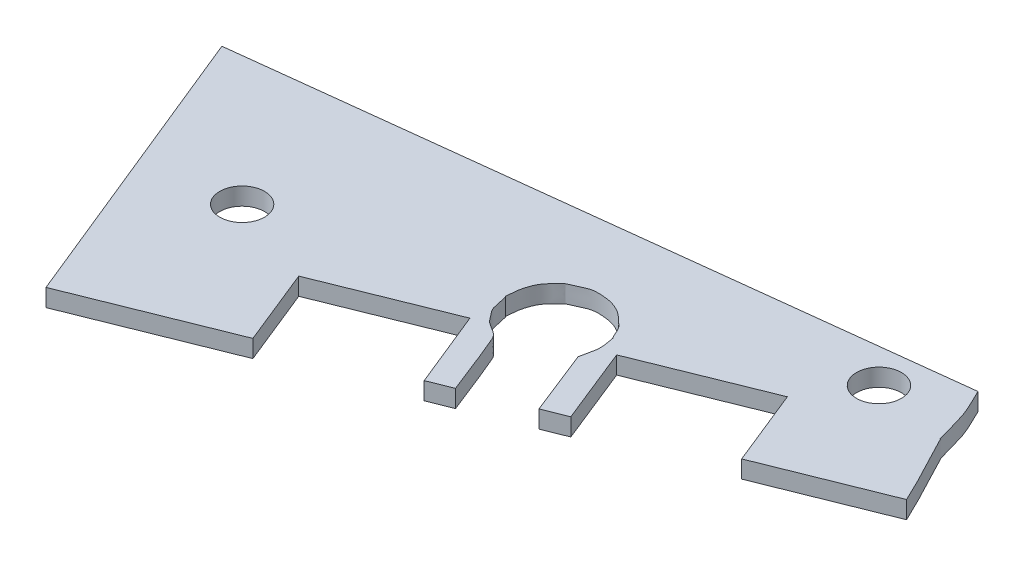
ISO-10303-21;
HEADER;
FILE_DESCRIPTION(('STEP AP214'),'2;1');
FILE_NAME('part.step','',(''),(''),'','','');
FILE_SCHEMA(('AUTOMOTIVE_DESIGN { 1 0 10303 214 1 1 1 1 }'));
ENDSEC;
DATA;
#1=APPLICATION_CONTEXT('core data for automotive mechanical design processes');
#2=APPLICATION_PROTOCOL_DEFINITION('international standard','automotive_design',2000,#1);
#3=PRODUCT_CONTEXT('',#1,'mechanical');
#4=PRODUCT('Part','Part','',(#3));
#5=PRODUCT_RELATED_PRODUCT_CATEGORY('part','',(#4));
#6=PRODUCT_DEFINITION_FORMATION('','',#4);
#7=PRODUCT_DEFINITION_CONTEXT('part definition',#1,'design');
#8=PRODUCT_DEFINITION('design','',#6,#7);
#9=PRODUCT_DEFINITION_SHAPE('','',#8);
#10=(LENGTH_UNIT() NAMED_UNIT(*) SI_UNIT(.MILLI.,.METRE.));
#11=(NAMED_UNIT(*) PLANE_ANGLE_UNIT() SI_UNIT($,.RADIAN.));
#12=(NAMED_UNIT(*) SI_UNIT($,.STERADIAN.) SOLID_ANGLE_UNIT());
#13=UNCERTAINTY_MEASURE_WITH_UNIT(LENGTH_MEASURE(1.E-05),#10,'distance_accuracy_value','');
#14=(GEOMETRIC_REPRESENTATION_CONTEXT(3) GLOBAL_UNCERTAINTY_ASSIGNED_CONTEXT((#13)) GLOBAL_UNIT_ASSIGNED_CONTEXT((#10,
#11,#12)) REPRESENTATION_CONTEXT('',''));
#15=CARTESIAN_POINT('',(0.,0.,0.));
#16=DIRECTION('',(0.,0.,1.));
#17=DIRECTION('',(1.,0.,0.));
#18=AXIS2_PLACEMENT_3D('',#15,#16,#17);
#19=CARTESIAN_POINT('',(35.9788581902602,1.19,-26.9467232131162));
#20=DIRECTION('',(0.,-1.,0.));
#21=DIRECTION('',(0.,0.,-1.));
#22=AXIS2_PLACEMENT_3D('',#19,#20,#21);
#23=PLANE('',#22);
#24=CARTESIAN_POINT('',(4.44394552127311,1.19,-18.6221592118428));
#25=DIRECTION('',(0.,1.,0.));
#26=DIRECTION('',(0.,0.,1.));
#27=AXIS2_PLACEMENT_3D('',#24,#25,#26);
#28=CIRCLE('',#27,1.27912148996529);
#29=CARTESIAN_POINT('',(4.44394552127311,1.19,-17.3430377218775));
#30=VERTEX_POINT('',#29);
#31=EDGE_CURVE('E210',#30,#30,#28,.T.);
#32=ORIENTED_EDGE('',*,*,#31,.F.);
#33=EDGE_LOOP('',(#32));
#34=FACE_BOUND('',#33,.T.);
#35=CARTESIAN_POINT('',(31.5819941178303,1.19,-27.8440418080723));
#36=DIRECTION('',(0.,1.,0.));
#37=DIRECTION('',(0.,0.,1.));
#38=AXIS2_PLACEMENT_3D('',#35,#36,#37);
#39=CIRCLE('',#38,1.28155859149822);
#40=CARTESIAN_POINT('',(31.5819941178303,1.19,-26.562483216574));
#41=VERTEX_POINT('',#40);
#42=EDGE_CURVE('E238',#41,#41,#39,.T.);
#43=ORIENTED_EDGE('',*,*,#42,.F.);
#44=EDGE_LOOP('',(#43));
#45=FACE_BOUND('',#44,.T.);
#46=DIRECTION('',(0.927982637445173,0.,-0.372623435387928));
#47=VECTOR('',#46,1.);
#48=CARTESIAN_POINT('',(37.6295653212787,1.19,-22.8357967076553));
#49=LINE('',#48,#47);
#50=CARTESIAN_POINT('',(2.95481325968816,1.19,-8.91244866960769));
#51=VERTEX_POINT('',#50);
#52=CARTESIAN_POINT('',(11.3831987343169,1.19,-12.2967942635902));
#53=VERTEX_POINT('',#52);
#54=EDGE_CURVE('E189',#51,#53,#49,.T.);
#55=ORIENTED_EDGE('',*,*,#54,.T.);
#56=DIRECTION('',(0.374266862491585,0.,0.927321042379987));
#57=VECTOR('',#56,1.);
#58=CARTESIAN_POINT('',(11.3765404474495,1.19,-12.313291501623));
#59=LINE('',#58,#57);
#60=CARTESIAN_POINT('',(9.61148219190338,1.19,-16.6865765167537));
#61=VERTEX_POINT('',#60);
#62=EDGE_CURVE('E196',#61,#53,#59,.T.);
#63=ORIENTED_EDGE('',*,*,#62,.F.);
#64=DIRECTION('',(-0.927552927526245,0.,0.373691807024842));
#65=VECTOR('',#64,1.);
#66=CARTESIAN_POINT('',(9.61148219190338,1.19,-16.6865765167537));
#67=LINE('',#66,#65);
#68=CARTESIAN_POINT('',(16.5777826434056,1.19,-19.4931542620719));
#69=VERTEX_POINT('',#68);
#70=EDGE_CURVE('E193',#69,#61,#67,.T.);
#71=ORIENTED_EDGE('',*,*,#70,.F.);
#72=DIRECTION('',(-0.376190054881045,0.,-0.926542520669503));
#73=VECTOR('',#72,1.);
#74=CARTESIAN_POINT('',(16.5777826434056,1.19,-19.4931542620719));
#75=LINE('',#74,#73);
#76=CARTESIAN_POINT('',(18.3618671807341,1.19,-15.0990184712505));
#77=VERTEX_POINT('',#76);
#78=EDGE_CURVE('E199',#77,#69,#75,.T.);
#79=ORIENTED_EDGE('',*,*,#78,.F.);
#80=CARTESIAN_POINT('',(19.6380180243655,1.19,-15.6114458510734));
#81=VERTEX_POINT('',#80);
#82=EDGE_CURVE('E313',#77,#81,#49,.T.);
#83=ORIENTED_EDGE('',*,*,#82,.T.);
#84=CARTESIAN_POINT('',(22.9999228700686,1.19,-7.20708420605326));
#85=CARTESIAN_POINT('',(22.0115475346655,1.19,-9.98661151399347));
#86=CARTESIAN_POINT('',(21.5188945967217,1.19,-10.8820647279259));
#87=CARTESIAN_POINT('',(20.0021583951109,1.19,-14.686998305048));
#88=CARTESIAN_POINT('',(19.3466827716481,1.19,-16.3313456912646));
#89=CARTESIAN_POINT('',(19.1275109478908,1.19,-16.988826809381));
#90=CARTESIAN_POINT('',(18.2342460124436,1.19,-19.0982296967628));
#91=CARTESIAN_POINT('',(18.0311634837373,1.19,-19.5777994810791));
#92=CARTESIAN_POINT('',(17.4655783405814,1.19,-19.6171123035761));
#93=CARTESIAN_POINT('',(17.1976734702197,1.19,-20.0183884446883));
#94=CARTESIAN_POINT('',(17.0440445021911,1.19,-20.2484986303312));
#95=CARTESIAN_POINT('',(16.8068058528764,1.19,-20.4410440927477));
#96=CARTESIAN_POINT('',(16.7367865661339,1.19,-20.708719001617));
#97=CARTESIAN_POINT('',(16.6637645790077,1.19,-20.9878728556309));
#98=CARTESIAN_POINT('',(16.617400623009,1.19,-21.2735503084374));
#99=CARTESIAN_POINT('',(16.5443786358828,1.19,-21.5527041624513));
#100=CARTESIAN_POINT('',(16.5398013319158,1.19,-21.5702026186516));
#101=CARTESIAN_POINT('',(16.5187823531704,1.19,-21.5782662639945));
#102=CARTESIAN_POINT('',(16.5059842118141,1.19,-21.5910473147661));
#103=B_SPLINE_CURVE_WITH_KNOTS('',3,(#84,#85,#86,#87,#88,#89,#90,#91,#92,#93,#94,#95,#96,#97,
#98,#99,#100,#101,#102),.UNSPECIFIED.,.F.,.F.,(4,3,3,3,3,3,4),(0.,1.,2.,3.,4.,5.,6.),.UNSPECIFIED.);
#104=CARTESIAN_POINT('',(16.5059842118141,1.19,-21.5910473147661));
#105=VERTEX_POINT('',#104);
#106=EDGE_CURVE('E246',#81,#105,#103,.T.);
#107=ORIENTED_EDGE('',*,*,#106,.T.);
#108=CARTESIAN_POINT('',(16.5059842118141,1.19,-21.5910473147661));
#109=CARTESIAN_POINT('',(16.5442005480148,1.19,-21.885227935876));
#110=CARTESIAN_POINT('',(16.5456222551934,1.19,-22.1865768416264));
#111=CARTESIAN_POINT('',(16.6206332204162,1.19,-22.4735891780956));
#112=CARTESIAN_POINT('',(16.6873028559704,1.19,-22.7286853205747));
#113=CARTESIAN_POINT('',(16.7797045426985,1.19,-22.9842094668508));
#114=CARTESIAN_POINT('',(16.927205728982,1.19,-23.2027553024496));
#115=CARTESIAN_POINT('',(17.1043517025042,1.19,-23.4652244783381));
#116=CARTESIAN_POINT('',(17.3614582266607,1.19,-23.6637417898316));
#117=CARTESIAN_POINT('',(17.5791172474616,1.19,-23.8937316045859));
#118=CARTESIAN_POINT('',(17.5915498323038,1.19,-23.9068685188028));
#119=CARTESIAN_POINT('',(17.6011399453458,1.19,-23.9243355141276));
#120=CARTESIAN_POINT('',(17.6174661535773,1.19,-23.9321202816761));
#121=CARTESIAN_POINT('',(17.8706540099005,1.19,-24.0528469427378));
#122=CARTESIAN_POINT('',(18.1314751599277,1.19,-24.157110454786));
#123=CARTESIAN_POINT('',(18.3846630162509,1.19,-24.2778371158476));
#124=CARTESIAN_POINT('',(18.7432825901617,1.19,-24.4488364061703));
#125=CARTESIAN_POINT('',(19.1802781374837,1.19,-24.4079919107509));
#126=CARTESIAN_POINT('',(19.5740557849677,1.19,-24.3551911491583));
#127=CARTESIAN_POINT('',(19.870796871569,1.19,-24.3154018023823));
#128=CARTESIAN_POINT('',(20.1598661302531,1.19,-24.1997934174334));
#129=CARTESIAN_POINT('',(20.4183282841305,1.19,-24.0486782970542));
#130=CARTESIAN_POINT('',(20.6925799422208,1.19,-23.888331524017));
#131=CARTESIAN_POINT('',(20.9054886390425,1.19,-23.640779489755));
#132=CARTESIAN_POINT('',(21.1476534923825,1.19,-23.4351554556649));
#133=CARTESIAN_POINT('',(21.3834549378282,1.19,-23.2349346400177));
#134=CARTESIAN_POINT('',(21.4548822220276,1.19,-22.8981514571216));
#135=CARTESIAN_POINT('',(21.6084965868502,1.19,-22.62964945785));
#136=CARTESIAN_POINT('',(21.6174785008867,1.19,-22.6139500024059));
#137=CARTESIAN_POINT('',(21.6439024964264,1.19,-22.6091401363415));
#138=CARTESIAN_POINT('',(21.6468852639403,1.19,-22.5913005517343));
#139=CARTESIAN_POINT('',(21.6958062885552,1.19,-22.2987096093937));
#140=CARTESIAN_POINT('',(21.7741519992741,1.19,-22.0052996032961));
#141=CARTESIAN_POINT('',(21.7624490049559,1.19,-21.7088780013283));
#142=CARTESIAN_POINT('',(21.7485944835091,1.19,-21.3579610197319));
#143=CARTESIAN_POINT('',(21.6349109717166,1.19,-21.0181734675178));
#144=CARTESIAN_POINT('',(21.571141955097,1.19,-20.6728212006125));
#145=B_SPLINE_CURVE_WITH_KNOTS('',3,(#108,#109,#110,#111,#112,#113,#114,#115,#116,#117,#118,
#119,#120,#121,#122,#123,#124,#125,#126,#127,#128,#129,#130,#131,#132,#133,#134,#135,#136,#137,
#138,#139,#140,#141,#142,#143,#144),.UNSPECIFIED.,.F.,.F.,(4,3,3,3,3,3,3,3,3,3,3,3,4),(0.,1.,2.,
3.,4.,5.,6.,7.,8.,9.,10.,11.,12.),.UNSPECIFIED.);
#146=CARTESIAN_POINT('',(21.571141955097,1.19,-20.6728212006125));
#147=VERTEX_POINT('',#146);
#148=EDGE_CURVE('E252',#105,#147,#145,.T.);
#149=ORIENTED_EDGE('',*,*,#148,.T.);
#150=DIRECTION('',(0.36884552030541,0.,0.929490711169634));
#151=VECTOR('',#150,1.);
#152=CARTESIAN_POINT('',(26.3793084328849,1.19,-8.55624167658697));
#153=LINE('',#152,#151);
#154=CARTESIAN_POINT('',(23.0378834854703,1.19,-16.9766325440717));
#155=VERTEX_POINT('',#154);
#156=EDGE_CURVE('E283',#147,#155,#153,.T.);
#157=ORIENTED_EDGE('',*,*,#156,.T.);
#158=CARTESIAN_POINT('',(24.3349122983001,1.19,-17.4974432926051));
#159=VERTEX_POINT('',#158);
#160=EDGE_CURVE('E185',#155,#159,#49,.T.);
#161=ORIENTED_EDGE('',*,*,#160,.T.);
#162=DIRECTION('',(0.372273642828144,0.,0.928123017091734));
#163=VECTOR('',#162,1.);
#164=CARTESIAN_POINT('',(24.3349122983001,1.19,-17.4974432926051));
#165=LINE('',#164,#163);
#166=CARTESIAN_POINT('',(22.5826617144535,1.19,-21.8660149868715));
#167=VERTEX_POINT('',#166);
#168=EDGE_CURVE('E217',#167,#159,#165,.T.);
#169=ORIENTED_EDGE('',*,*,#168,.F.);
#170=DIRECTION('',(-0.927373213546552,0.,0.374137572019093));
#171=VECTOR('',#170,1.);
#172=CARTESIAN_POINT('',(22.5826617144535,1.19,-21.8660149868715));
#173=LINE('',#172,#171);
#174=CARTESIAN_POINT('',(29.5280116278823,1.19,-24.6680328966792));
#175=VERTEX_POINT('',#174);
#176=EDGE_CURVE('E214',#175,#167,#173,.T.);
#177=ORIENTED_EDGE('',*,*,#176,.F.);
#178=DIRECTION('',(-0.374514129456685,0.,-0.927221207068357));
#179=VECTOR('',#178,1.);
#180=CARTESIAN_POINT('',(29.5280116278823,1.19,-24.6680328966792));
#181=LINE('',#180,#179);
#182=CARTESIAN_POINT('',(31.2953894742109,1.19,-20.2923629522742));
#183=VERTEX_POINT('',#182);
#184=EDGE_CURVE('E221',#183,#175,#181,.T.);
#185=ORIENTED_EDGE('',*,*,#184,.F.);
#186=CARTESIAN_POINT('',(38.0127620025457,1.19,-22.98966603456));
#187=VERTEX_POINT('',#186);
#188=EDGE_CURVE('E181',#183,#187,#49,.T.);
#189=ORIENTED_EDGE('',*,*,#188,.T.);
#190=CARTESIAN_POINT('',(41.3064860387741,1.19,-14.4944209133861));
#191=CARTESIAN_POINT('',(40.4413769049084,1.19,-16.9603625473752));
#192=CARTESIAN_POINT('',(38.8653273947854,1.19,-21.0390813626115));
#193=CARTESIAN_POINT('',(38.2178251849978,1.19,-22.5309199781212));
#194=CARTESIAN_POINT('',(37.5641807720796,1.19,-24.0369101682144));
#195=CARTESIAN_POINT('',(36.7438854848778,1.19,-25.4649666392258));
#196=CARTESIAN_POINT('',(35.9992618023672,1.19,-26.9281115543455));
#197=CARTESIAN_POINT('',(35.9910572987333,1.19,-26.9442329564106));
#198=CARTESIAN_POINT('',(35.9659381842422,1.19,-26.9489216293106));
#199=CARTESIAN_POINT('',(35.9606172707881,1.19,-26.9662103934202));
#200=CARTESIAN_POINT('',(35.7688797215146,1.19,-27.5892059164559));
#201=CARTESIAN_POINT('',(35.6349446760462,1.19,-28.230797201937));
#202=CARTESIAN_POINT('',(35.4100442098563,1.19,-28.8426031269095));
#203=CARTESIAN_POINT('',(35.2164658014839,1.19,-29.3692023785491));
#204=CARTESIAN_POINT('',(34.9423080858761,1.19,-29.8625739139352));
#205=CARTESIAN_POINT('',(34.7084400238859,1.19,-30.3725593074478));
#206=B_SPLINE_CURVE_WITH_KNOTS('',3,(#190,#191,#192,#193,#194,#195,#196,#197,#198,#199,#200,
#201,#202,#203,#204,#205),.UNSPECIFIED.,.F.,.F.,(4,3,3,3,3,4),(0.,1.,2.,3.,4.,5.),.UNSPECIFIED.);
#207=CARTESIAN_POINT('',(34.708440023886,1.19,-30.3725593074478));
#208=VERTEX_POINT('',#207);
#209=EDGE_CURVE('E178',#187,#208,#206,.T.);
#210=ORIENTED_EDGE('',*,*,#209,.T.);
#211=DIRECTION('',(-0.99324873051463,0.,0.116004134974039));
#212=VECTOR('',#211,1.);
#213=CARTESIAN_POINT('',(-3.94816815876049,1.19,-25.8577522349688));
#214=LINE('',#213,#212);
#215=CARTESIAN_POINT('',(-3.94816815876049,1.19,-25.8577522349688));
#216=VERTEX_POINT('',#215);
#217=EDGE_CURVE('E282',#208,#216,#214,.T.);
#218=ORIENTED_EDGE('',*,*,#217,.T.);
#219=DIRECTION('',(0.377265914837246,0.,0.926104977581924));
#220=VECTOR('',#219,1.);
#221=CARTESIAN_POINT('',(6.37170948359056,1.19,-0.524718751833313));
#222=LINE('',#221,#220);
#223=EDGE_CURVE('E242',#216,#51,#222,.T.);
#224=ORIENTED_EDGE('',*,*,#223,.T.);
#225=EDGE_LOOP('',(#55,#63,#71,#79,#83,#107,#149,#157,#161,#169,#177,#185,#189,#210,#218,#224));
#226=FACE_BOUND('',#225,.T.);
#227=ADVANCED_FACE('F38',(#34,#45,#226),#23,.F.);
#228=CARTESIAN_POINT('',(6.37170948359056,1.19,-0.524718751833313));
#229=DIRECTION('',(0.926104977581924,0.,-0.377265914837246));
#230=DIRECTION('',(-0.377265914837246,0.,-0.926104977581924));
#231=AXIS2_PLACEMENT_3D('',#228,#229,#230);
#232=PLANE('',#231);
#233=DIRECTION('',(0.,-1.,0.));
#234=VECTOR('',#233,1.);
#235=CARTESIAN_POINT('',(-3.94816815876049,1.19,-25.8577522349688));
#236=LINE('',#235,#234);
#237=CARTESIAN_POINT('',(-3.94816815876049,0.19,-25.8577522349688));
#238=VERTEX_POINT('',#237);
#239=EDGE_CURVE('E289',#216,#238,#236,.T.);
#240=ORIENTED_EDGE('',*,*,#239,.T.);
#241=DIRECTION('',(0.377265914837246,0.,0.926104977581924));
#242=VECTOR('',#241,1.);
#243=CARTESIAN_POINT('',(6.37170948359056,0.19,-0.524718751833313));
#244=LINE('',#243,#242);
#245=CARTESIAN_POINT('',(2.95481325968815,0.19,-8.91244866960768));
#246=VERTEX_POINT('',#245);
#247=EDGE_CURVE('E162',#238,#246,#244,.T.);
#248=ORIENTED_EDGE('',*,*,#247,.T.);
#249=DIRECTION('',(0.,1.,0.));
#250=VECTOR('',#249,1.);
#251=CARTESIAN_POINT('',(2.95481325968816,1.19,-8.91244866960769));
#252=LINE('',#251,#250);
#253=EDGE_CURVE('E187',#246,#51,#252,.T.);
#254=ORIENTED_EDGE('',*,*,#253,.T.);
#255=ORIENTED_EDGE('',*,*,#223,.F.);
#256=EDGE_LOOP('',(#240,#248,#254,#255));
#257=FACE_BOUND('',#256,.T.);
#258=ADVANCED_FACE('F40',(#257),#232,.F.);
#259=DIRECTION('',(0.,-1.,0.));
#260=VECTOR('',#259,1.);
#261=SURFACE_OF_LINEAR_EXTRUSION('',#103,#260);
#262=DIRECTION('',(0.,-1.,0.));
#263=VECTOR('',#262,1.);
#264=CARTESIAN_POINT('',(19.6380180243592,1.19,-15.6114458510708));
#265=LINE('',#264,#263);
#266=CARTESIAN_POINT('',(19.6380180243655,0.19,-15.6114458510734));
#267=VERTEX_POINT('',#266);
#268=EDGE_CURVE('E320',#81,#267,#265,.T.);
#269=ORIENTED_EDGE('',*,*,#268,.T.);
#270=CARTESIAN_POINT('',(22.9999228700686,0.19,-7.20708420605326));
#271=CARTESIAN_POINT('',(22.0115475346655,0.19,-9.98661151399347));
#272=CARTESIAN_POINT('',(21.5188945967217,0.19,-10.8820647279259));
#273=CARTESIAN_POINT('',(20.0021583951109,0.19,-14.686998305048));
#274=CARTESIAN_POINT('',(19.3466827716481,0.19,-16.3313456912646));
#275=CARTESIAN_POINT('',(19.1275109478908,0.19,-16.988826809381));
#276=CARTESIAN_POINT('',(18.2342460124436,0.19,-19.0982296967628));
#277=CARTESIAN_POINT('',(18.0311634837373,0.19,-19.5777994810791));
#278=CARTESIAN_POINT('',(17.4655783405814,0.19,-19.6171123035761));
#279=CARTESIAN_POINT('',(17.1976734702197,0.19,-20.0183884446883));
#280=CARTESIAN_POINT('',(17.0440445021911,0.19,-20.2484986303312));
#281=CARTESIAN_POINT('',(16.8068058528764,0.19,-20.4410440927477));
#282=CARTESIAN_POINT('',(16.7367865661339,0.19,-20.708719001617));
#283=CARTESIAN_POINT('',(16.6637645790077,0.19,-20.9878728556309));
#284=CARTESIAN_POINT('',(16.617400623009,0.19,-21.2735503084374));
#285=CARTESIAN_POINT('',(16.5443786358828,0.19,-21.5527041624513));
#286=CARTESIAN_POINT('',(16.5398013319158,0.19,-21.5702026186516));
#287=CARTESIAN_POINT('',(16.5187823531704,0.19,-21.5782662639945));
#288=CARTESIAN_POINT('',(16.5059842118141,0.19,-21.5910473147661));
#289=B_SPLINE_CURVE_WITH_KNOTS('',3,(#270,#271,#272,#273,#274,#275,#276,#277,#278,#279,#280,
#281,#282,#283,#284,#285,#286,#287,#288),.UNSPECIFIED.,.F.,.F.,(4,3,3,3,3,3,4),(0.,1.,2.,3.,4.,
5.,6.),.UNSPECIFIED.);
#290=CARTESIAN_POINT('',(16.5059842118141,0.19,-21.5910473147661));
#291=VERTEX_POINT('',#290);
#292=EDGE_CURVE('E321',#267,#291,#289,.T.);
#293=ORIENTED_EDGE('',*,*,#292,.T.);
#294=DIRECTION('',(0.,-1.,0.));
#295=VECTOR('',#294,1.);
#296=CARTESIAN_POINT('',(16.5059842118141,1.19,-21.5910473147661));
#297=LINE('',#296,#295);
#298=EDGE_CURVE('E300',#105,#291,#297,.T.);
#299=ORIENTED_EDGE('',*,*,#298,.F.);
#300=ORIENTED_EDGE('',*,*,#106,.F.);
#301=EDGE_LOOP('',(#269,#293,#299,#300));
#302=FACE_BOUND('',#301,.T.);
#303=ADVANCED_FACE('F260',(#302),#261,.F.);
#304=DIRECTION('',(0.,-1.,0.));
#305=VECTOR('',#304,1.);
#306=SURFACE_OF_LINEAR_EXTRUSION('',#145,#305);
#307=ORIENTED_EDGE('',*,*,#298,.T.);
#308=CARTESIAN_POINT('',(16.5059842118141,0.19,-21.5910473147661));
#309=CARTESIAN_POINT('',(16.5442005480148,0.19,-21.885227935876));
#310=CARTESIAN_POINT('',(16.5456222551934,0.19,-22.1865768416264));
#311=CARTESIAN_POINT('',(16.6206332204162,0.19,-22.4735891780956));
#312=CARTESIAN_POINT('',(16.6873028559704,0.19,-22.7286853205747));
#313=CARTESIAN_POINT('',(16.7797045426985,0.19,-22.9842094668508));
#314=CARTESIAN_POINT('',(16.927205728982,0.19,-23.2027553024496));
#315=CARTESIAN_POINT('',(17.1043517025042,0.19,-23.4652244783381));
#316=CARTESIAN_POINT('',(17.3614582266607,0.19,-23.6637417898316));
#317=CARTESIAN_POINT('',(17.5791172474616,0.19,-23.8937316045859));
#318=CARTESIAN_POINT('',(17.5915498323038,0.19,-23.9068685188028));
#319=CARTESIAN_POINT('',(17.6011399453458,0.19,-23.9243355141276));
#320=CARTESIAN_POINT('',(17.6174661535773,0.19,-23.9321202816761));
#321=CARTESIAN_POINT('',(17.8706540099005,0.19,-24.0528469427378));
#322=CARTESIAN_POINT('',(18.1314751599277,0.19,-24.157110454786));
#323=CARTESIAN_POINT('',(18.3846630162509,0.19,-24.2778371158476));
#324=CARTESIAN_POINT('',(18.7432825901617,0.19,-24.4488364061703));
#325=CARTESIAN_POINT('',(19.1802781374837,0.19,-24.4079919107509));
#326=CARTESIAN_POINT('',(19.5740557849677,0.19,-24.3551911491583));
#327=CARTESIAN_POINT('',(19.870796871569,0.19,-24.3154018023823));
#328=CARTESIAN_POINT('',(20.1598661302531,0.19,-24.1997934174334));
#329=CARTESIAN_POINT('',(20.4183282841305,0.19,-24.0486782970542));
#330=CARTESIAN_POINT('',(20.6925799422208,0.19,-23.888331524017));
#331=CARTESIAN_POINT('',(20.9054886390425,0.19,-23.640779489755));
#332=CARTESIAN_POINT('',(21.1476534923825,0.19,-23.4351554556649));
#333=CARTESIAN_POINT('',(21.3834549378282,0.19,-23.2349346400177));
#334=CARTESIAN_POINT('',(21.4548822220276,0.19,-22.8981514571216));
#335=CARTESIAN_POINT('',(21.6084965868502,0.19,-22.62964945785));
#336=CARTESIAN_POINT('',(21.6174785008867,0.19,-22.6139500024059));
#337=CARTESIAN_POINT('',(21.6439024964264,0.19,-22.6091401363415));
#338=CARTESIAN_POINT('',(21.6468852639403,0.19,-22.5913005517343));
#339=CARTESIAN_POINT('',(21.6958062885552,0.19,-22.2987096093937));
#340=CARTESIAN_POINT('',(21.7741519992741,0.19,-22.0052996032961));
#341=CARTESIAN_POINT('',(21.7624490049559,0.19,-21.7088780013283));
#342=CARTESIAN_POINT('',(21.7485944835091,0.19,-21.3579610197319));
#343=CARTESIAN_POINT('',(21.6349109717166,0.19,-21.0181734675178));
#344=CARTESIAN_POINT('',(21.571141955097,0.19,-20.6728212006125));
#345=B_SPLINE_CURVE_WITH_KNOTS('',3,(#308,#309,#310,#311,#312,#313,#314,#315,#316,#317,#318,
#319,#320,#321,#322,#323,#324,#325,#326,#327,#328,#329,#330,#331,#332,#333,#334,#335,#336,#337,
#338,#339,#340,#341,#342,#343,#344),.UNSPECIFIED.,.F.,.F.,(4,3,3,3,3,3,3,3,3,3,3,3,4),(0.,1.,2.,
3.,4.,5.,6.,7.,8.,9.,10.,11.,12.),.UNSPECIFIED.);
#346=CARTESIAN_POINT('',(21.571141955097,0.19,-20.6728212006125));
#347=VERTEX_POINT('',#346);
#348=EDGE_CURVE('E328',#291,#347,#345,.T.);
#349=ORIENTED_EDGE('',*,*,#348,.T.);
#350=DIRECTION('',(0.,-1.,0.));
#351=VECTOR('',#350,1.);
#352=CARTESIAN_POINT('',(21.571141955097,1.19,-20.6728212006125));
#353=LINE('',#352,#351);
#354=EDGE_CURVE('E296',#147,#347,#353,.T.);
#355=ORIENTED_EDGE('',*,*,#354,.F.);
#356=ORIENTED_EDGE('',*,*,#148,.F.);
#357=EDGE_LOOP('',(#307,#349,#355,#356));
#358=FACE_BOUND('',#357,.T.);
#359=ADVANCED_FACE('F263',(#358),#306,.F.);
#360=CARTESIAN_POINT('',(26.3793084328849,1.19,-8.55624167658697));
#361=DIRECTION('',(0.929490711169634,0.,-0.36884552030541));
#362=DIRECTION('',(-0.36884552030541,0.,-0.929490711169634));
#363=AXIS2_PLACEMENT_3D('',#360,#361,#362);
#364=PLANE('',#363);
#365=ORIENTED_EDGE('',*,*,#354,.T.);
#366=DIRECTION('',(0.36884552030541,0.,0.929490711169634));
#367=VECTOR('',#366,1.);
#368=CARTESIAN_POINT('',(26.3793084328849,0.19,-8.55624167658697));
#369=LINE('',#368,#367);
#370=CARTESIAN_POINT('',(23.0378834854703,0.19,-16.9766325440717));
#371=VERTEX_POINT('',#370);
#372=EDGE_CURVE('E356',#347,#371,#369,.T.);
#373=ORIENTED_EDGE('',*,*,#372,.T.);
#374=DIRECTION('',(0.,1.,0.));
#375=VECTOR('',#374,1.);
#376=CARTESIAN_POINT('',(23.0378834854703,1.19,-16.9766325440717));
#377=LINE('',#376,#375);
#378=EDGE_CURVE('E180',#371,#155,#377,.T.);
#379=ORIENTED_EDGE('',*,*,#378,.T.);
#380=ORIENTED_EDGE('',*,*,#156,.F.);
#381=EDGE_LOOP('',(#365,#373,#379,#380));
#382=FACE_BOUND('',#381,.T.);
#383=ADVANCED_FACE('F267',(#382),#364,.F.);
#384=DIRECTION('',(0.,-1.,0.));
#385=VECTOR('',#384,1.);
#386=SURFACE_OF_LINEAR_EXTRUSION('',#206,#385);
#387=DIRECTION('',(0.,-1.,0.));
#388=VECTOR('',#387,1.);
#389=CARTESIAN_POINT('',(38.0127620021032,1.19,-22.9896660343823));
#390=LINE('',#389,#388);
#391=CARTESIAN_POINT('',(38.0127620025457,0.19,-22.98966603456));
#392=VERTEX_POINT('',#391);
#393=EDGE_CURVE('E167',#187,#392,#390,.T.);
#394=ORIENTED_EDGE('',*,*,#393,.T.);
#395=CARTESIAN_POINT('',(41.3064860387741,0.19,-14.4944209133861));
#396=CARTESIAN_POINT('',(40.4413769049084,0.19,-16.9603625473752));
#397=CARTESIAN_POINT('',(38.8653273947854,0.19,-21.0390813626115));
#398=CARTESIAN_POINT('',(38.2178251849978,0.19,-22.5309199781212));
#399=CARTESIAN_POINT('',(37.5641807720796,0.19,-24.0369101682144));
#400=CARTESIAN_POINT('',(36.7438854848778,0.19,-25.4649666392258));
#401=CARTESIAN_POINT('',(35.9992618023672,0.19,-26.9281115543455));
#402=CARTESIAN_POINT('',(35.9910572987333,0.19,-26.9442329564106));
#403=CARTESIAN_POINT('',(35.9659381842422,0.19,-26.9489216293106));
#404=CARTESIAN_POINT('',(35.9606172707881,0.19,-26.9662103934202));
#405=CARTESIAN_POINT('',(35.7688797215146,0.19,-27.5892059164559));
#406=CARTESIAN_POINT('',(35.6349446760462,0.19,-28.230797201937));
#407=CARTESIAN_POINT('',(35.4100442098563,0.19,-28.8426031269095));
#408=CARTESIAN_POINT('',(35.2164658014839,0.19,-29.3692023785491));
#409=CARTESIAN_POINT('',(34.9423080858761,0.19,-29.8625739139352));
#410=CARTESIAN_POINT('',(34.7084400238859,0.19,-30.3725593074478));
#411=B_SPLINE_CURVE_WITH_KNOTS('',3,(#395,#396,#397,#398,#399,#400,#401,#402,#403,#404,#405,
#406,#407,#408,#409,#410),.UNSPECIFIED.,.F.,.F.,(4,3,3,3,3,4),(0.,1.,2.,3.,4.,5.),.UNSPECIFIED.);
#412=CARTESIAN_POINT('',(34.708440023886,0.19,-30.3725593074478));
#413=VERTEX_POINT('',#412);
#414=EDGE_CURVE('E150',#392,#413,#411,.T.);
#415=ORIENTED_EDGE('',*,*,#414,.T.);
#416=DIRECTION('',(0.,-1.,0.));
#417=VECTOR('',#416,1.);
#418=CARTESIAN_POINT('',(34.708440023886,1.19,-30.3725593074478));
#419=LINE('',#418,#417);
#420=EDGE_CURVE('E293',#208,#413,#419,.T.);
#421=ORIENTED_EDGE('',*,*,#420,.F.);
#422=ORIENTED_EDGE('',*,*,#209,.F.);
#423=EDGE_LOOP('',(#394,#415,#421,#422));
#424=FACE_BOUND('',#423,.T.);
#425=ADVANCED_FACE('F177',(#424),#386,.F.);
#426=CARTESIAN_POINT('',(-3.94816815876049,1.19,-25.8577522349688));
#427=DIRECTION('',(0.116004134974039,0.,0.99324873051463));
#428=DIRECTION('',(0.99324873051463,0.,-0.116004134974039));
#429=AXIS2_PLACEMENT_3D('',#426,#427,#428);
#430=PLANE('',#429);
#431=ORIENTED_EDGE('',*,*,#420,.T.);
#432=DIRECTION('',(-0.99324873051463,0.,0.116004134974039));
#433=VECTOR('',#432,1.);
#434=CARTESIAN_POINT('',(-3.94816815876049,0.19,-25.8577522349688));
#435=LINE('',#434,#433);
#436=EDGE_CURVE('E156',#413,#238,#435,.T.);
#437=ORIENTED_EDGE('',*,*,#436,.T.);
#438=ORIENTED_EDGE('',*,*,#239,.F.);
#439=ORIENTED_EDGE('',*,*,#217,.F.);
#440=EDGE_LOOP('',(#431,#437,#438,#439));
#441=FACE_BOUND('',#440,.T.);
#442=ADVANCED_FACE('F275',(#441),#430,.F.);
#443=CARTESIAN_POINT('',(31.5819941178303,1.19,-27.8440418080723));
#444=DIRECTION('',(0.,-1.,0.));
#445=DIRECTION('',(0.,0.,-1.));
#446=AXIS2_PLACEMENT_3D('',#443,#444,#445);
#447=CYLINDRICAL_SURFACE('',#446,1.28155859149822);
#448=CARTESIAN_POINT('',(31.5819941178303,0.19,-27.8440418080723));
#449=DIRECTION('',(0.,1.,0.));
#450=DIRECTION('',(0.,0.,1.));
#451=AXIS2_PLACEMENT_3D('',#448,#449,#450);
#452=CIRCLE('',#451,1.28155859149822);
#453=CARTESIAN_POINT('',(31.5819941178303,0.19,-26.562483216574));
#454=VERTEX_POINT('',#453);
#455=EDGE_CURVE('E342',#454,#454,#452,.T.);
#456=ORIENTED_EDGE('',*,*,#455,.F.);
#457=EDGE_LOOP('',(#456));
#458=FACE_BOUND('',#457,.T.);
#459=ORIENTED_EDGE('',*,*,#42,.T.);
#460=EDGE_LOOP('',(#459));
#461=FACE_BOUND('',#460,.T.);
#462=ADVANCED_FACE('F433',(#458,#461),#447,.F.);
#463=CARTESIAN_POINT('',(22.5826617144535,1.19,-21.8660149868715));
#464=DIRECTION('',(0.374137572019093,0.,0.927373213546552));
#465=DIRECTION('',(0.927373213546552,0.,-0.374137572019093));
#466=AXIS2_PLACEMENT_3D('',#463,#464,#465);
#467=PLANE('',#466);
#468=DIRECTION('',(-0.927373213546552,0.,0.374137572019093));
#469=VECTOR('',#468,1.);
#470=CARTESIAN_POINT('',(22.5826617144535,0.19,-21.8660149868715));
#471=LINE('',#470,#469);
#472=CARTESIAN_POINT('',(29.5280116278823,0.19,-24.6680328966792));
#473=VERTEX_POINT('',#472);
#474=CARTESIAN_POINT('',(22.5826617144535,0.19,-21.8660149868715));
#475=VERTEX_POINT('',#474);
#476=EDGE_CURVE('E400',#473,#475,#471,.T.);
#477=ORIENTED_EDGE('',*,*,#476,.F.);
#478=DIRECTION('',(0.,-1.,0.));
#479=VECTOR('',#478,1.);
#480=CARTESIAN_POINT('',(29.5280116278823,1.19,-24.6680328966792));
#481=LINE('',#480,#479);
#482=EDGE_CURVE('E224',#175,#473,#481,.T.);
#483=ORIENTED_EDGE('',*,*,#482,.F.);
#484=ORIENTED_EDGE('',*,*,#176,.T.);
#485=DIRECTION('',(0.,-1.,0.));
#486=VECTOR('',#485,1.);
#487=CARTESIAN_POINT('',(22.5826617144535,1.19,-21.8660149868715));
#488=LINE('',#487,#486);
#489=EDGE_CURVE('E234',#167,#475,#488,.T.);
#490=ORIENTED_EDGE('',*,*,#489,.T.);
#491=EDGE_LOOP('',(#477,#483,#484,#490));
#492=FACE_BOUND('',#491,.T.);
#493=ADVANCED_FACE('F409',(#492),#467,.T.);
#494=CARTESIAN_POINT('',(24.3349122983001,1.19,-17.4974432926051));
#495=DIRECTION('',(0.928123017091734,0.,-0.372273642828144));
#496=DIRECTION('',(-0.372273642828144,0.,-0.928123017091734));
#497=AXIS2_PLACEMENT_3D('',#494,#495,#496);
#498=PLANE('',#497);
#499=DIRECTION('',(0.372273642828144,0.,0.928123017091734));
#500=VECTOR('',#499,1.);
#501=CARTESIAN_POINT('',(24.3349122983001,0.19,-17.4974432926051));
#502=LINE('',#501,#500);
#503=CARTESIAN_POINT('',(24.3349122983001,0.19,-17.4974432926051));
#504=VERTEX_POINT('',#503);
#505=EDGE_CURVE('E54',#475,#504,#502,.T.);
#506=ORIENTED_EDGE('',*,*,#505,.F.);
#507=ORIENTED_EDGE('',*,*,#489,.F.);
#508=ORIENTED_EDGE('',*,*,#168,.T.);
#509=DIRECTION('',(0.,-1.,0.));
#510=VECTOR('',#509,1.);
#511=CARTESIAN_POINT('',(24.3349122983001,1.19,-17.4974432926051));
#512=LINE('',#511,#510);
#513=EDGE_CURVE('E230',#159,#504,#512,.T.);
#514=ORIENTED_EDGE('',*,*,#513,.T.);
#515=EDGE_LOOP('',(#506,#507,#508,#514));
#516=FACE_BOUND('',#515,.T.);
#517=ADVANCED_FACE('F408',(#516),#498,.T.);
#518=CARTESIAN_POINT('',(29.5280116278823,1.19,-24.6680328966792));
#519=DIRECTION('',(-0.927221207068357,0.,0.374514129456685));
#520=DIRECTION('',(0.374514129456685,0.,0.927221207068357));
#521=AXIS2_PLACEMENT_3D('',#518,#519,#520);
#522=PLANE('',#521);
#523=DIRECTION('',(-0.374514129456685,0.,-0.927221207068357));
#524=VECTOR('',#523,1.);
#525=CARTESIAN_POINT('',(29.5280116278823,0.19,-24.6680328966792));
#526=LINE('',#525,#524);
#527=CARTESIAN_POINT('',(31.2953894742109,0.19,-20.2923629522742));
#528=VERTEX_POINT('',#527);
#529=EDGE_CURVE('E397',#528,#473,#526,.T.);
#530=ORIENTED_EDGE('',*,*,#529,.F.);
#531=DIRECTION('',(0.,-1.,0.));
#532=VECTOR('',#531,1.);
#533=CARTESIAN_POINT('',(31.2953894742109,1.19,-20.2923629522742));
#534=LINE('',#533,#532);
#535=EDGE_CURVE('E170',#183,#528,#534,.T.);
#536=ORIENTED_EDGE('',*,*,#535,.F.);
#537=ORIENTED_EDGE('',*,*,#184,.T.);
#538=ORIENTED_EDGE('',*,*,#482,.T.);
#539=EDGE_LOOP('',(#530,#536,#537,#538));
#540=FACE_BOUND('',#539,.T.);
#541=ADVANCED_FACE('F413',(#540),#522,.T.);
#542=CARTESIAN_POINT('',(4.44394552127311,1.19,-18.6221592118428));
#543=DIRECTION('',(0.,-1.,0.));
#544=DIRECTION('',(0.,0.,-1.));
#545=AXIS2_PLACEMENT_3D('',#542,#543,#544);
#546=CYLINDRICAL_SURFACE('',#545,1.27912148996529);
#547=CARTESIAN_POINT('',(4.44394552127311,0.19,-18.6221592118428));
#548=DIRECTION('',(0.,1.,0.));
#549=DIRECTION('',(0.,0.,1.));
#550=AXIS2_PLACEMENT_3D('',#547,#548,#549);
#551=CIRCLE('',#550,1.27912148996529);
#552=CARTESIAN_POINT('',(4.44394552127311,0.19,-17.3430377218775));
#553=VERTEX_POINT('',#552);
#554=EDGE_CURVE('E393',#553,#553,#551,.T.);
#555=ORIENTED_EDGE('',*,*,#554,.F.);
#556=EDGE_LOOP('',(#555));
#557=FACE_BOUND('',#556,.T.);
#558=ORIENTED_EDGE('',*,*,#31,.T.);
#559=EDGE_LOOP('',(#558));
#560=FACE_BOUND('',#559,.T.);
#561=ADVANCED_FACE('F415',(#557,#560),#546,.F.);
#562=CARTESIAN_POINT('',(9.61148219190338,1.19,-16.6865765167537));
#563=DIRECTION('',(0.373691807024842,0.,0.927552927526245));
#564=DIRECTION('',(0.927552927526246,0.,-0.373691807024842));
#565=AXIS2_PLACEMENT_3D('',#562,#563,#564);
#566=PLANE('',#565);
#567=DIRECTION('',(-0.927552927526246,0.,0.373691807024842));
#568=VECTOR('',#567,1.);
#569=CARTESIAN_POINT('',(9.61148219190338,0.19,-16.6865765167537));
#570=LINE('',#569,#568);
#571=CARTESIAN_POINT('',(16.5777826434056,0.19,-19.4931542620719));
#572=VERTEX_POINT('',#571);
#573=CARTESIAN_POINT('',(9.61148219190338,0.19,-16.6865765167537));
#574=VERTEX_POINT('',#573);
#575=EDGE_CURVE('E387',#572,#574,#570,.T.);
#576=ORIENTED_EDGE('',*,*,#575,.F.);
#577=DIRECTION('',(0.,-1.,0.));
#578=VECTOR('',#577,1.);
#579=CARTESIAN_POINT('',(16.5777826434056,1.19,-19.4931542620719));
#580=LINE('',#579,#578);
#581=EDGE_CURVE('E202',#69,#572,#580,.T.);
#582=ORIENTED_EDGE('',*,*,#581,.F.);
#583=ORIENTED_EDGE('',*,*,#70,.T.);
#584=DIRECTION('',(0.,-1.,0.));
#585=VECTOR('',#584,1.);
#586=CARTESIAN_POINT('',(9.61148219190338,1.19,-16.6865765167537));
#587=LINE('',#586,#585);
#588=EDGE_CURVE('E206',#61,#574,#587,.T.);
#589=ORIENTED_EDGE('',*,*,#588,.T.);
#590=EDGE_LOOP('',(#576,#582,#583,#589));
#591=FACE_BOUND('',#590,.T.);
#592=ADVANCED_FACE('F421',(#591),#566,.T.);
#593=CARTESIAN_POINT('',(11.3765404474495,1.19,-12.313291501623));
#594=DIRECTION('',(0.927321042379987,0.,-0.374266862491585));
#595=DIRECTION('',(-0.374266862491585,0.,-0.927321042379987));
#596=AXIS2_PLACEMENT_3D('',#593,#594,#595);
#597=PLANE('',#596);
#598=DIRECTION('',(0.374266862491585,0.,0.927321042379987));
#599=VECTOR('',#598,1.);
#600=CARTESIAN_POINT('',(11.3765404474495,0.19,-12.313291501623));
#601=LINE('',#600,#599);
#602=CARTESIAN_POINT('',(11.3831987343169,0.19,-12.2967942635902));
#603=VERTEX_POINT('',#602);
#604=EDGE_CURVE('E390',#574,#603,#601,.T.);
#605=ORIENTED_EDGE('',*,*,#604,.F.);
#606=ORIENTED_EDGE('',*,*,#588,.F.);
#607=ORIENTED_EDGE('',*,*,#62,.T.);
#608=DIRECTION('',(0.,1.,0.));
#609=VECTOR('',#608,1.);
#610=CARTESIAN_POINT('',(11.3831987343169,2.54,-12.2967942635902));
#611=LINE('',#610,#609);
#612=EDGE_CURVE('E47',#603,#53,#611,.T.);
#613=ORIENTED_EDGE('',*,*,#612,.F.);
#614=EDGE_LOOP('',(#605,#606,#607,#613));
#615=FACE_BOUND('',#614,.T.);
#616=ADVANCED_FACE('F466',(#615),#597,.T.);
#617=CARTESIAN_POINT('',(16.5777826434056,1.19,-19.4931542620719));
#618=DIRECTION('',(-0.926542520669503,0.,0.376190054881045));
#619=DIRECTION('',(0.376190054881045,0.,0.926542520669503));
#620=AXIS2_PLACEMENT_3D('',#617,#618,#619);
#621=PLANE('',#620);
#622=DIRECTION('',(-0.376190054881045,0.,-0.926542520669503));
#623=VECTOR('',#622,1.);
#624=CARTESIAN_POINT('',(16.5777826434056,0.19,-19.4931542620719));
#625=LINE('',#624,#623);
#626=CARTESIAN_POINT('',(18.3618671807341,0.19,-15.0990184712505));
#627=VERTEX_POINT('',#626);
#628=EDGE_CURVE('E172',#627,#572,#625,.T.);
#629=ORIENTED_EDGE('',*,*,#628,.F.);
#630=DIRECTION('',(0.,-1.,0.));
#631=VECTOR('',#630,1.);
#632=CARTESIAN_POINT('',(18.3618671807341,1.19,-15.0990184712505));
#633=LINE('',#632,#631);
#634=EDGE_CURVE('E304',#77,#627,#633,.T.);
#635=ORIENTED_EDGE('',*,*,#634,.F.);
#636=ORIENTED_EDGE('',*,*,#78,.T.);
#637=ORIENTED_EDGE('',*,*,#581,.T.);
#638=EDGE_LOOP('',(#629,#635,#636,#637));
#639=FACE_BOUND('',#638,.T.);
#640=ADVANCED_FACE('F474',(#639),#621,.T.);
#641=CARTESIAN_POINT('',(2.12189954212739,2.54,-8.57799934017445));
#642=DIRECTION('',(-0.372623435387928,0.,-0.927982637445173));
#643=DIRECTION('',(-0.927982637445173,0.,0.372623435387928));
#644=AXIS2_PLACEMENT_3D('',#641,#642,#643);
#645=PLANE('',#644);
#646=ORIENTED_EDGE('',*,*,#634,.T.);
#647=DIRECTION('',(-0.927982637445173,0.,0.372623435387928));
#648=VECTOR('',#647,1.);
#649=CARTESIAN_POINT('',(38.0127620025457,0.19,-22.98966603456));
#650=LINE('',#649,#648);
#651=EDGE_CURVE('E173',#267,#627,#650,.T.);
#652=ORIENTED_EDGE('',*,*,#651,.F.);
#653=ORIENTED_EDGE('',*,*,#268,.F.);
#654=ORIENTED_EDGE('',*,*,#82,.F.);
#655=EDGE_LOOP('',(#646,#652,#653,#654));
#656=FACE_BOUND('',#655,.T.);
#657=ADVANCED_FACE('F380',(#656),#645,.F.);
#658=ORIENTED_EDGE('',*,*,#253,.F.);
#659=EDGE_CURVE('E175',#603,#246,#650,.T.);
#660=ORIENTED_EDGE('',*,*,#659,.F.);
#661=ORIENTED_EDGE('',*,*,#612,.T.);
#662=ORIENTED_EDGE('',*,*,#54,.F.);
#663=EDGE_LOOP('',(#658,#660,#661,#662));
#664=FACE_BOUND('',#663,.T.);
#665=ADVANCED_FACE('F337',(#664),#645,.F.);
#666=ORIENTED_EDGE('',*,*,#535,.T.);
#667=EDGE_CURVE('E153',#392,#528,#650,.T.);
#668=ORIENTED_EDGE('',*,*,#667,.F.);
#669=ORIENTED_EDGE('',*,*,#393,.F.);
#670=ORIENTED_EDGE('',*,*,#188,.F.);
#671=EDGE_LOOP('',(#666,#668,#669,#670));
#672=FACE_BOUND('',#671,.T.);
#673=ADVANCED_FACE('F166',(#672),#645,.F.);
#674=ORIENTED_EDGE('',*,*,#378,.F.);
#675=DIRECTION('',(0.927982637445173,0.,-0.372623435387928));
#676=VECTOR('',#675,1.);
#677=CARTESIAN_POINT('',(2.12189954212739,0.19,-8.57799934017445));
#678=LINE('',#677,#676);
#679=EDGE_CURVE('E11',#371,#504,#678,.T.);
#680=ORIENTED_EDGE('',*,*,#679,.T.);
#681=ORIENTED_EDGE('',*,*,#513,.F.);
#682=ORIENTED_EDGE('',*,*,#160,.F.);
#683=EDGE_LOOP('',(#674,#680,#681,#682));
#684=FACE_BOUND('',#683,.T.);
#685=ADVANCED_FACE('F495',(#684),#645,.F.);
#686=CARTESIAN_POINT('',(30.6303465006401,0.19,-41.3748580476238));
#687=DIRECTION('',(0.,1.,0.));
#688=DIRECTION('',(0.,0.,1.));
#689=AXIS2_PLACEMENT_3D('',#686,#687,#688);
#690=PLANE('',#689);
#691=ORIENTED_EDGE('',*,*,#455,.T.);
#692=EDGE_LOOP('',(#691));
#693=FACE_BOUND('',#692,.T.);
#694=ORIENTED_EDGE('',*,*,#554,.T.);
#695=EDGE_LOOP('',(#694));
#696=FACE_BOUND('',#695,.T.);
#697=ORIENTED_EDGE('',*,*,#651,.T.);
#698=ORIENTED_EDGE('',*,*,#628,.T.);
#699=ORIENTED_EDGE('',*,*,#575,.T.);
#700=ORIENTED_EDGE('',*,*,#604,.T.);
#701=ORIENTED_EDGE('',*,*,#659,.T.);
#702=ORIENTED_EDGE('',*,*,#247,.F.);
#703=ORIENTED_EDGE('',*,*,#436,.F.);
#704=ORIENTED_EDGE('',*,*,#414,.F.);
#705=ORIENTED_EDGE('',*,*,#667,.T.);
#706=ORIENTED_EDGE('',*,*,#529,.T.);
#707=ORIENTED_EDGE('',*,*,#476,.T.);
#708=ORIENTED_EDGE('',*,*,#505,.T.);
#709=ORIENTED_EDGE('',*,*,#679,.F.);
#710=ORIENTED_EDGE('',*,*,#372,.F.);
#711=ORIENTED_EDGE('',*,*,#348,.F.);
#712=ORIENTED_EDGE('',*,*,#292,.F.);
#713=EDGE_LOOP('',(#697,#698,#699,#700,#701,#702,#703,#704,#705,#706,#707,#708,#709,#710,#711,#712));
#714=FACE_BOUND('',#713,.T.);
#715=ADVANCED_FACE('F152',(#693,#696,#714),#690,.F.);
#716=CLOSED_SHELL('',(#227,#258,#303,#359,#383,#425,#442,#462,#493,#517,#541,#561,#592,#616,
#640,#657,#665,#673,#685,#715));
#717=MANIFOLD_SOLID_BREP('B2',#716);
#718=ADVANCED_BREP_SHAPE_REPRESENTATION('',(#18,#717),#14);
#719=SHAPE_DEFINITION_REPRESENTATION(#9,#718);
ENDSEC;
END-ISO-10303-21;
